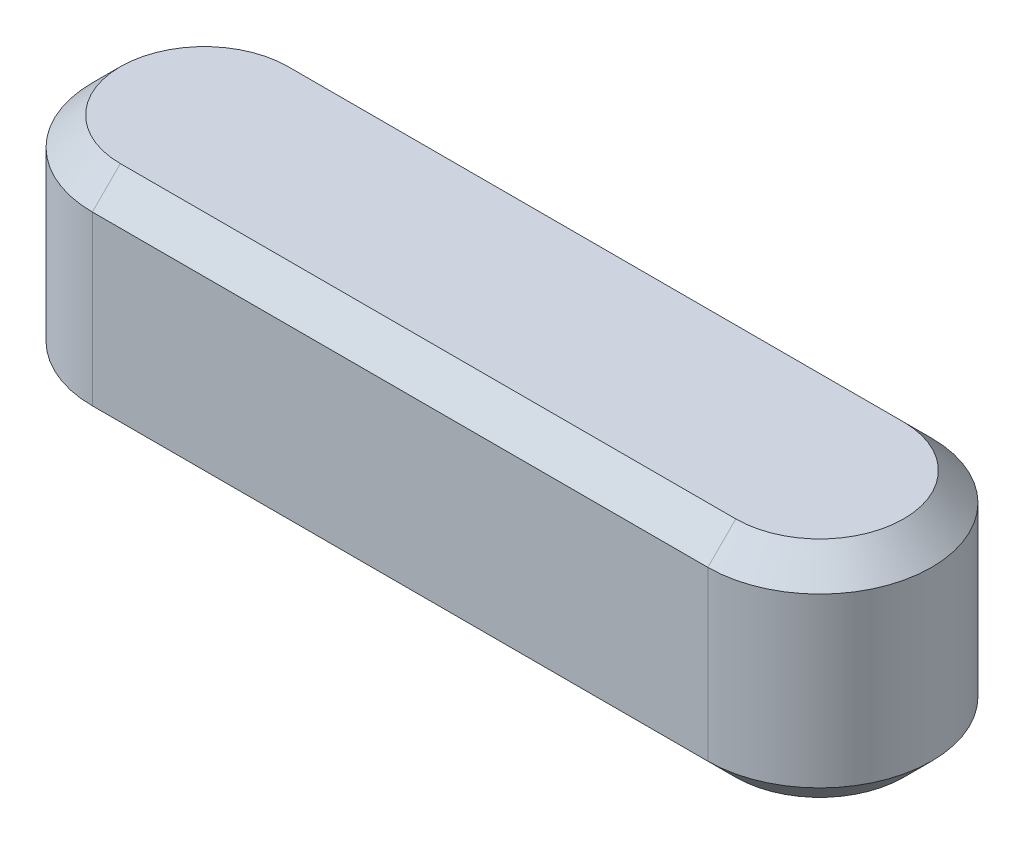
ISO-10303-21;
HEADER;
FILE_DESCRIPTION(('STEP AP214'),'2;1');
FILE_NAME('part.step','',(''),(''),'','','');
FILE_SCHEMA(('AUTOMOTIVE_DESIGN { 1 0 10303 214 1 1 1 1 }'));
ENDSEC;
DATA;
#1=APPLICATION_CONTEXT('core data for automotive mechanical design processes');
#2=APPLICATION_PROTOCOL_DEFINITION('international standard','automotive_design',2000,#1);
#3=PRODUCT_CONTEXT('',#1,'mechanical');
#4=PRODUCT('Part','Part','',(#3));
#5=PRODUCT_RELATED_PRODUCT_CATEGORY('part','',(#4));
#6=PRODUCT_DEFINITION_FORMATION('','',#4);
#7=PRODUCT_DEFINITION_CONTEXT('part definition',#1,'design');
#8=PRODUCT_DEFINITION('design','',#6,#7);
#9=PRODUCT_DEFINITION_SHAPE('','',#8);
#10=(LENGTH_UNIT() NAMED_UNIT(*) SI_UNIT(.MILLI.,.METRE.));
#11=(NAMED_UNIT(*) PLANE_ANGLE_UNIT() SI_UNIT($,.RADIAN.));
#12=(NAMED_UNIT(*) SI_UNIT($,.STERADIAN.) SOLID_ANGLE_UNIT());
#13=UNCERTAINTY_MEASURE_WITH_UNIT(LENGTH_MEASURE(1.E-05),#10,'distance_accuracy_value','');
#14=(GEOMETRIC_REPRESENTATION_CONTEXT(3) GLOBAL_UNCERTAINTY_ASSIGNED_CONTEXT((#13)) GLOBAL_UNIT_ASSIGNED_CONTEXT((#10,
#11,#12)) REPRESENTATION_CONTEXT('',''));
#15=CARTESIAN_POINT('',(0.,0.,0.));
#16=DIRECTION('',(0.,0.,1.));
#17=DIRECTION('',(1.,0.,0.));
#18=AXIS2_PLACEMENT_3D('',#15,#16,#17);
#19=CARTESIAN_POINT('',(5.5,4.,0.));
#20=DIRECTION('',(0.,-1.,0.));
#21=DIRECTION('',(0.,0.,-1.));
#22=AXIS2_PLACEMENT_3D('',#19,#20,#21);
#23=CYLINDRICAL_SURFACE('',#22,2.);
#24=DIRECTION('',(0.,-1.,0.));
#25=VECTOR('',#24,1.);
#26=CARTESIAN_POINT('',(5.5,4.,2.));
#27=LINE('',#26,#25);
#28=CARTESIAN_POINT('',(5.5,3.5,2.));
#29=VERTEX_POINT('',#28);
#30=CARTESIAN_POINT('',(5.5,0.500000000000005,2.));
#31=VERTEX_POINT('',#30);
#32=EDGE_CURVE('E106',#29,#31,#27,.T.);
#33=ORIENTED_EDGE('',*,*,#32,.T.);
#34=CARTESIAN_POINT('',(5.5,0.500000000000005,0.));
#35=DIRECTION('',(0.,-1.,0.));
#36=DIRECTION('',(0.,0.,-1.));
#37=AXIS2_PLACEMENT_3D('',#34,#35,#36);
#38=CIRCLE('',#37,2.);
#39=CARTESIAN_POINT('',(5.5,0.500000000000005,-2.));
#40=VERTEX_POINT('',#39);
#41=EDGE_CURVE('E154',#31,#40,#38,.F.);
#42=ORIENTED_EDGE('',*,*,#41,.T.);
#43=DIRECTION('',(0.,-1.,0.));
#44=VECTOR('',#43,1.);
#45=CARTESIAN_POINT('',(5.5,4.,-2.));
#46=LINE('',#45,#44);
#47=CARTESIAN_POINT('',(5.5,3.5,-2.));
#48=VERTEX_POINT('',#47);
#49=EDGE_CURVE('E131',#48,#40,#46,.T.);
#50=ORIENTED_EDGE('',*,*,#49,.F.);
#51=CARTESIAN_POINT('',(5.5,3.5,0.));
#52=DIRECTION('',(0.,-1.,0.));
#53=DIRECTION('',(0.,0.,-1.));
#54=AXIS2_PLACEMENT_3D('',#51,#52,#53);
#55=CIRCLE('',#54,2.);
#56=EDGE_CURVE('E156',#48,#29,#55,.T.);
#57=ORIENTED_EDGE('',*,*,#56,.T.);
#58=EDGE_LOOP('',(#33,#42,#50,#57));
#59=FACE_BOUND('',#58,.T.);
#60=ADVANCED_FACE('F32',(#59),#23,.T.);
#61=CARTESIAN_POINT('',(-5.5,4.,-2.));
#62=DIRECTION('',(0.,0.,1.));
#63=DIRECTION('',(1.,0.,0.));
#64=AXIS2_PLACEMENT_3D('',#61,#62,#63);
#65=PLANE('',#64);
#66=ORIENTED_EDGE('',*,*,#49,.T.);
#67=DIRECTION('',(-1.,0.,0.));
#68=VECTOR('',#67,1.);
#69=CARTESIAN_POINT('',(-5.5,0.500000000000005,-2.));
#70=LINE('',#69,#68);
#71=CARTESIAN_POINT('',(-5.5,0.500000000000005,-2.));
#72=VERTEX_POINT('',#71);
#73=EDGE_CURVE('E158',#40,#72,#70,.T.);
#74=ORIENTED_EDGE('',*,*,#73,.T.);
#75=DIRECTION('',(0.,-1.,0.));
#76=VECTOR('',#75,1.);
#77=CARTESIAN_POINT('',(-5.5,4.,-2.));
#78=LINE('',#77,#76);
#79=CARTESIAN_POINT('',(-5.5,3.5,-2.));
#80=VERTEX_POINT('',#79);
#81=EDGE_CURVE('E122',#80,#72,#78,.T.);
#82=ORIENTED_EDGE('',*,*,#81,.F.);
#83=DIRECTION('',(1.,0.,0.));
#84=VECTOR('',#83,1.);
#85=CARTESIAN_POINT('',(-5.5,3.5,-2.));
#86=LINE('',#85,#84);
#87=EDGE_CURVE('E160',#80,#48,#86,.T.);
#88=ORIENTED_EDGE('',*,*,#87,.T.);
#89=EDGE_LOOP('',(#66,#74,#82,#88));
#90=FACE_BOUND('',#89,.T.);
#91=ADVANCED_FACE('F199',(#90),#65,.F.);
#92=CARTESIAN_POINT('',(-5.5,4.,0.));
#93=DIRECTION('',(0.,-1.,0.));
#94=DIRECTION('',(0.,0.,-1.));
#95=AXIS2_PLACEMENT_3D('',#92,#93,#94);
#96=CYLINDRICAL_SURFACE('',#95,2.);
#97=ORIENTED_EDGE('',*,*,#81,.T.);
#98=CARTESIAN_POINT('',(-5.5,0.500000000000005,0.));
#99=DIRECTION('',(0.,-1.,0.));
#100=DIRECTION('',(0.,0.,-1.));
#101=AXIS2_PLACEMENT_3D('',#98,#99,#100);
#102=CIRCLE('',#101,2.);
#103=CARTESIAN_POINT('',(-5.5,0.500000000000005,2.));
#104=VERTEX_POINT('',#103);
#105=EDGE_CURVE('E121',#72,#104,#102,.F.);
#106=ORIENTED_EDGE('',*,*,#105,.T.);
#107=DIRECTION('',(0.,-1.,0.));
#108=VECTOR('',#107,1.);
#109=CARTESIAN_POINT('',(-5.5,4.,2.));
#110=LINE('',#109,#108);
#111=CARTESIAN_POINT('',(-5.5,3.5,2.));
#112=VERTEX_POINT('',#111);
#113=EDGE_CURVE('E104',#112,#104,#110,.T.);
#114=ORIENTED_EDGE('',*,*,#113,.F.);
#115=CARTESIAN_POINT('',(-5.5,3.5,0.));
#116=DIRECTION('',(0.,-1.,0.));
#117=DIRECTION('',(0.,0.,-1.));
#118=AXIS2_PLACEMENT_3D('',#115,#116,#117);
#119=CIRCLE('',#118,2.);
#120=EDGE_CURVE('E118',#112,#80,#119,.T.);
#121=ORIENTED_EDGE('',*,*,#120,.T.);
#122=EDGE_LOOP('',(#97,#106,#114,#121));
#123=FACE_BOUND('',#122,.T.);
#124=ADVANCED_FACE('F117',(#123),#96,.T.);
#125=CARTESIAN_POINT('',(-5.5,4.,2.));
#126=DIRECTION('',(0.,0.,-1.));
#127=DIRECTION('',(-1.,0.,0.));
#128=AXIS2_PLACEMENT_3D('',#125,#126,#127);
#129=PLANE('',#128);
#130=ORIENTED_EDGE('',*,*,#113,.T.);
#131=DIRECTION('',(1.,0.,0.));
#132=VECTOR('',#131,1.);
#133=CARTESIAN_POINT('',(5.5,0.500000000000005,2.));
#134=LINE('',#133,#132);
#135=EDGE_CURVE('E110',#104,#31,#134,.T.);
#136=ORIENTED_EDGE('',*,*,#135,.T.);
#137=ORIENTED_EDGE('',*,*,#32,.F.);
#138=DIRECTION('',(-1.,0.,0.));
#139=VECTOR('',#138,1.);
#140=CARTESIAN_POINT('',(-5.5,3.5,2.));
#141=LINE('',#140,#139);
#142=EDGE_CURVE('E101',#29,#112,#141,.T.);
#143=ORIENTED_EDGE('',*,*,#142,.T.);
#144=EDGE_LOOP('',(#130,#136,#137,#143));
#145=FACE_BOUND('',#144,.T.);
#146=ADVANCED_FACE('F103',(#145),#129,.F.);
#147=CARTESIAN_POINT('',(5.5,4.,0.));
#148=DIRECTION('',(0.,-1.,0.));
#149=DIRECTION('',(0.,0.,-1.));
#150=AXIS2_PLACEMENT_3D('',#147,#148,#149);
#151=PLANE('',#150);
#152=DIRECTION('',(1.,0.,0.));
#153=VECTOR('',#152,1.);
#154=CARTESIAN_POINT('',(5.5,4.,1.5));
#155=LINE('',#154,#153);
#156=CARTESIAN_POINT('',(-5.5,4.,1.5));
#157=VERTEX_POINT('',#156);
#158=CARTESIAN_POINT('',(5.5,4.,1.5));
#159=VERTEX_POINT('',#158);
#160=EDGE_CURVE('E41',#157,#159,#155,.T.);
#161=ORIENTED_EDGE('',*,*,#160,.T.);
#162=CARTESIAN_POINT('',(5.5,4.,0.));
#163=DIRECTION('',(0.,-1.,0.));
#164=DIRECTION('',(0.,0.,-1.));
#165=AXIS2_PLACEMENT_3D('',#162,#163,#164);
#166=CIRCLE('',#165,1.5);
#167=CARTESIAN_POINT('',(5.5,4.,-1.5));
#168=VERTEX_POINT('',#167);
#169=EDGE_CURVE('E11',#159,#168,#166,.F.);
#170=ORIENTED_EDGE('',*,*,#169,.T.);
#171=DIRECTION('',(-1.,0.,0.));
#172=VECTOR('',#171,1.);
#173=CARTESIAN_POINT('',(5.5,4.,-1.5));
#174=LINE('',#173,#172);
#175=CARTESIAN_POINT('',(-5.5,4.,-1.5));
#176=VERTEX_POINT('',#175);
#177=EDGE_CURVE('E150',#168,#176,#174,.T.);
#178=ORIENTED_EDGE('',*,*,#177,.T.);
#179=CARTESIAN_POINT('',(-5.5,4.,0.));
#180=DIRECTION('',(0.,-1.,0.));
#181=DIRECTION('',(0.,0.,-1.));
#182=AXIS2_PLACEMENT_3D('',#179,#180,#181);
#183=CIRCLE('',#182,1.5);
#184=EDGE_CURVE('E152',#176,#157,#183,.F.);
#185=ORIENTED_EDGE('',*,*,#184,.T.);
#186=EDGE_LOOP('',(#161,#170,#178,#185));
#187=FACE_BOUND('',#186,.T.);
#188=ADVANCED_FACE('F202',(#187),#151,.F.);
#189=CARTESIAN_POINT('',(5.5,0.,0.));
#190=DIRECTION('',(0.,-1.,0.));
#191=DIRECTION('',(0.,0.,-1.));
#192=AXIS2_PLACEMENT_3D('',#189,#190,#191);
#193=PLANE('',#192);
#194=DIRECTION('',(-1.,0.,0.));
#195=VECTOR('',#194,1.);
#196=CARTESIAN_POINT('',(-5.5,0.,1.49999999999999));
#197=LINE('',#196,#195);
#198=CARTESIAN_POINT('',(5.5,0.,1.49999999999999));
#199=VERTEX_POINT('',#198);
#200=CARTESIAN_POINT('',(-5.5,0.,1.49999999999999));
#201=VERTEX_POINT('',#200);
#202=EDGE_CURVE('E165',#199,#201,#197,.T.);
#203=ORIENTED_EDGE('',*,*,#202,.T.);
#204=CARTESIAN_POINT('',(-5.5,0.,0.));
#205=DIRECTION('',(0.,-1.,0.));
#206=DIRECTION('',(0.,0.,-1.));
#207=AXIS2_PLACEMENT_3D('',#204,#205,#206);
#208=CIRCLE('',#207,1.49999999999999);
#209=CARTESIAN_POINT('',(-5.5,0.,-1.49999999999999));
#210=VERTEX_POINT('',#209);
#211=EDGE_CURVE('E111',#201,#210,#208,.T.);
#212=ORIENTED_EDGE('',*,*,#211,.T.);
#213=DIRECTION('',(1.,0.,0.));
#214=VECTOR('',#213,1.);
#215=CARTESIAN_POINT('',(5.5,0.,-1.49999999999999));
#216=LINE('',#215,#214);
#217=CARTESIAN_POINT('',(5.5,0.,-1.49999999999999));
#218=VERTEX_POINT('',#217);
#219=EDGE_CURVE('E167',#210,#218,#216,.T.);
#220=ORIENTED_EDGE('',*,*,#219,.T.);
#221=CARTESIAN_POINT('',(5.5,0.,0.));
#222=DIRECTION('',(0.,-1.,0.));
#223=DIRECTION('',(0.,0.,-1.));
#224=AXIS2_PLACEMENT_3D('',#221,#222,#223);
#225=CIRCLE('',#224,1.49999999999999);
#226=EDGE_CURVE('E169',#218,#199,#225,.T.);
#227=ORIENTED_EDGE('',*,*,#226,.T.);
#228=EDGE_LOOP('',(#203,#212,#220,#227));
#229=FACE_BOUND('',#228,.T.);
#230=ADVANCED_FACE('F191',(#229),#193,.T.);
#231=CARTESIAN_POINT('',(5.5,0.500000000000005,0.));
#232=DIRECTION('',(0.,1.,0.));
#233=DIRECTION('',(0.,0.,1.));
#234=AXIS2_PLACEMENT_3D('',#231,#232,#233);
#235=CONICAL_SURFACE('',#234,2.,0.78539816339745);
#236=DIRECTION('',(0.,0.707106781186546,0.707106781186549));
#237=VECTOR('',#236,1.);
#238=CARTESIAN_POINT('',(5.5,0.,1.49999999999999));
#239=LINE('',#238,#237);
#240=EDGE_CURVE('E145',#199,#31,#239,.T.);
#241=ORIENTED_EDGE('',*,*,#240,.F.);
#242=ORIENTED_EDGE('',*,*,#226,.F.);
#243=DIRECTION('',(0.,-0.707106781186546,0.707106781186549));
#244=VECTOR('',#243,1.);
#245=CARTESIAN_POINT('',(5.5,0.500000000000005,-2.));
#246=LINE('',#245,#244);
#247=EDGE_CURVE('E142',#40,#218,#246,.T.);
#248=ORIENTED_EDGE('',*,*,#247,.F.);
#249=ORIENTED_EDGE('',*,*,#41,.F.);
#250=EDGE_LOOP('',(#241,#242,#248,#249));
#251=FACE_BOUND('',#250,.T.);
#252=ADVANCED_FACE('F181',(#251),#235,.T.);
#253=CARTESIAN_POINT('',(-5.5,0.500000000000005,-2.));
#254=DIRECTION('',(0.,-0.707106781186549,-0.707106781186546));
#255=DIRECTION('',(1.,0.,0.));
#256=AXIS2_PLACEMENT_3D('',#253,#254,#255);
#257=PLANE('',#256);
#258=ORIENTED_EDGE('',*,*,#247,.T.);
#259=ORIENTED_EDGE('',*,*,#219,.F.);
#260=DIRECTION('',(0.,-0.707106781186546,0.707106781186549));
#261=VECTOR('',#260,1.);
#262=CARTESIAN_POINT('',(-5.5,0.500000000000005,-2.));
#263=LINE('',#262,#261);
#264=EDGE_CURVE('E135',#72,#210,#263,.T.);
#265=ORIENTED_EDGE('',*,*,#264,.F.);
#266=ORIENTED_EDGE('',*,*,#73,.F.);
#267=EDGE_LOOP('',(#258,#259,#265,#266));
#268=FACE_BOUND('',#267,.T.);
#269=ADVANCED_FACE('F197',(#268),#257,.T.);
#270=CARTESIAN_POINT('',(-5.5,0.500000000000005,2.));
#271=DIRECTION('',(0.,-0.707106781186549,0.707106781186546));
#272=DIRECTION('',(-1.,0.,0.));
#273=AXIS2_PLACEMENT_3D('',#270,#271,#272);
#274=PLANE('',#273);
#275=ORIENTED_EDGE('',*,*,#240,.T.);
#276=ORIENTED_EDGE('',*,*,#135,.F.);
#277=DIRECTION('',(0.,0.707106781186546,0.707106781186549));
#278=VECTOR('',#277,1.);
#279=CARTESIAN_POINT('',(-5.5,0.,1.49999999999999));
#280=LINE('',#279,#278);
#281=EDGE_CURVE('E134',#201,#104,#280,.T.);
#282=ORIENTED_EDGE('',*,*,#281,.F.);
#283=ORIENTED_EDGE('',*,*,#202,.F.);
#284=EDGE_LOOP('',(#275,#276,#282,#283));
#285=FACE_BOUND('',#284,.T.);
#286=ADVANCED_FACE('F187',(#285),#274,.T.);
#287=CARTESIAN_POINT('',(-5.5,0.500000000000005,0.));
#288=DIRECTION('',(0.,1.,0.));
#289=DIRECTION('',(0.,0.,1.));
#290=AXIS2_PLACEMENT_3D('',#287,#288,#289);
#291=CONICAL_SURFACE('',#290,2.,0.78539816339745);
#292=ORIENTED_EDGE('',*,*,#264,.T.);
#293=ORIENTED_EDGE('',*,*,#211,.F.);
#294=ORIENTED_EDGE('',*,*,#281,.T.);
#295=ORIENTED_EDGE('',*,*,#105,.F.);
#296=EDGE_LOOP('',(#292,#293,#294,#295));
#297=FACE_BOUND('',#296,.T.);
#298=ADVANCED_FACE('F193',(#297),#291,.T.);
#299=CARTESIAN_POINT('',(-5.5,4.,0.));
#300=DIRECTION('',(0.,-1.,0.));
#301=DIRECTION('',(0.,0.,-1.));
#302=AXIS2_PLACEMENT_3D('',#299,#300,#301);
#303=CONICAL_SURFACE('',#302,1.5,0.785398163397447);
#304=DIRECTION('',(0.,0.707106781186549,0.707106781186547));
#305=VECTOR('',#304,1.);
#306=CARTESIAN_POINT('',(-5.5,3.5,-2.));
#307=LINE('',#306,#305);
#308=EDGE_CURVE('E129',#80,#176,#307,.T.);
#309=ORIENTED_EDGE('',*,*,#308,.F.);
#310=ORIENTED_EDGE('',*,*,#120,.F.);
#311=DIRECTION('',(0.,-0.707106781186549,0.707106781186547));
#312=VECTOR('',#311,1.);
#313=CARTESIAN_POINT('',(-5.5,4.,1.5));
#314=LINE('',#313,#312);
#315=EDGE_CURVE('E36',#157,#112,#314,.T.);
#316=ORIENTED_EDGE('',*,*,#315,.F.);
#317=ORIENTED_EDGE('',*,*,#184,.F.);
#318=EDGE_LOOP('',(#309,#310,#316,#317));
#319=FACE_BOUND('',#318,.T.);
#320=ADVANCED_FACE('F34',(#319),#303,.T.);
#321=CARTESIAN_POINT('',(5.5,4.,1.5));
#322=DIRECTION('',(0.,-0.707106781186547,-0.707106781186549));
#323=DIRECTION('',(1.,0.,0.));
#324=AXIS2_PLACEMENT_3D('',#321,#322,#323);
#325=PLANE('',#324);
#326=ORIENTED_EDGE('',*,*,#315,.T.);
#327=ORIENTED_EDGE('',*,*,#142,.F.);
#328=DIRECTION('',(0.,-0.707106781186549,0.707106781186547));
#329=VECTOR('',#328,1.);
#330=CARTESIAN_POINT('',(5.5,4.,1.5));
#331=LINE('',#330,#329);
#332=EDGE_CURVE('E137',#159,#29,#331,.T.);
#333=ORIENTED_EDGE('',*,*,#332,.F.);
#334=ORIENTED_EDGE('',*,*,#160,.F.);
#335=EDGE_LOOP('',(#326,#327,#333,#334));
#336=FACE_BOUND('',#335,.T.);
#337=ADVANCED_FACE('F133',(#336),#325,.F.);
#338=CARTESIAN_POINT('',(5.5,4.,-1.5));
#339=DIRECTION('',(0.,-0.707106781186547,0.707106781186549));
#340=DIRECTION('',(-1.,0.,0.));
#341=AXIS2_PLACEMENT_3D('',#338,#339,#340);
#342=PLANE('',#341);
#343=ORIENTED_EDGE('',*,*,#308,.T.);
#344=ORIENTED_EDGE('',*,*,#177,.F.);
#345=DIRECTION('',(0.,0.707106781186549,0.707106781186547));
#346=VECTOR('',#345,1.);
#347=CARTESIAN_POINT('',(5.5,3.5,-2.));
#348=LINE('',#347,#346);
#349=EDGE_CURVE('E55',#48,#168,#348,.T.);
#350=ORIENTED_EDGE('',*,*,#349,.F.);
#351=ORIENTED_EDGE('',*,*,#87,.F.);
#352=EDGE_LOOP('',(#343,#344,#350,#351));
#353=FACE_BOUND('',#352,.T.);
#354=ADVANCED_FACE('F201',(#353),#342,.F.);
#355=CARTESIAN_POINT('',(5.5,4.,0.));
#356=DIRECTION('',(0.,-1.,0.));
#357=DIRECTION('',(0.,0.,-1.));
#358=AXIS2_PLACEMENT_3D('',#355,#356,#357);
#359=CONICAL_SURFACE('',#358,1.5,0.785398163397447);
#360=ORIENTED_EDGE('',*,*,#332,.T.);
#361=ORIENTED_EDGE('',*,*,#56,.F.);
#362=ORIENTED_EDGE('',*,*,#349,.T.);
#363=ORIENTED_EDGE('',*,*,#169,.F.);
#364=EDGE_LOOP('',(#360,#361,#362,#363));
#365=FACE_BOUND('',#364,.T.);
#366=ADVANCED_FACE('F200',(#365),#359,.T.);
#367=CLOSED_SHELL('',(#60,#91,#124,#146,#188,#230,#252,#269,#286,#298,#320,#337,#354,#366));
#368=MANIFOLD_SOLID_BREP('B2',#367);
#369=ADVANCED_BREP_SHAPE_REPRESENTATION('',(#18,#368),#14);
#370=SHAPE_DEFINITION_REPRESENTATION(#9,#369);
ENDSEC;
END-ISO-10303-21;
